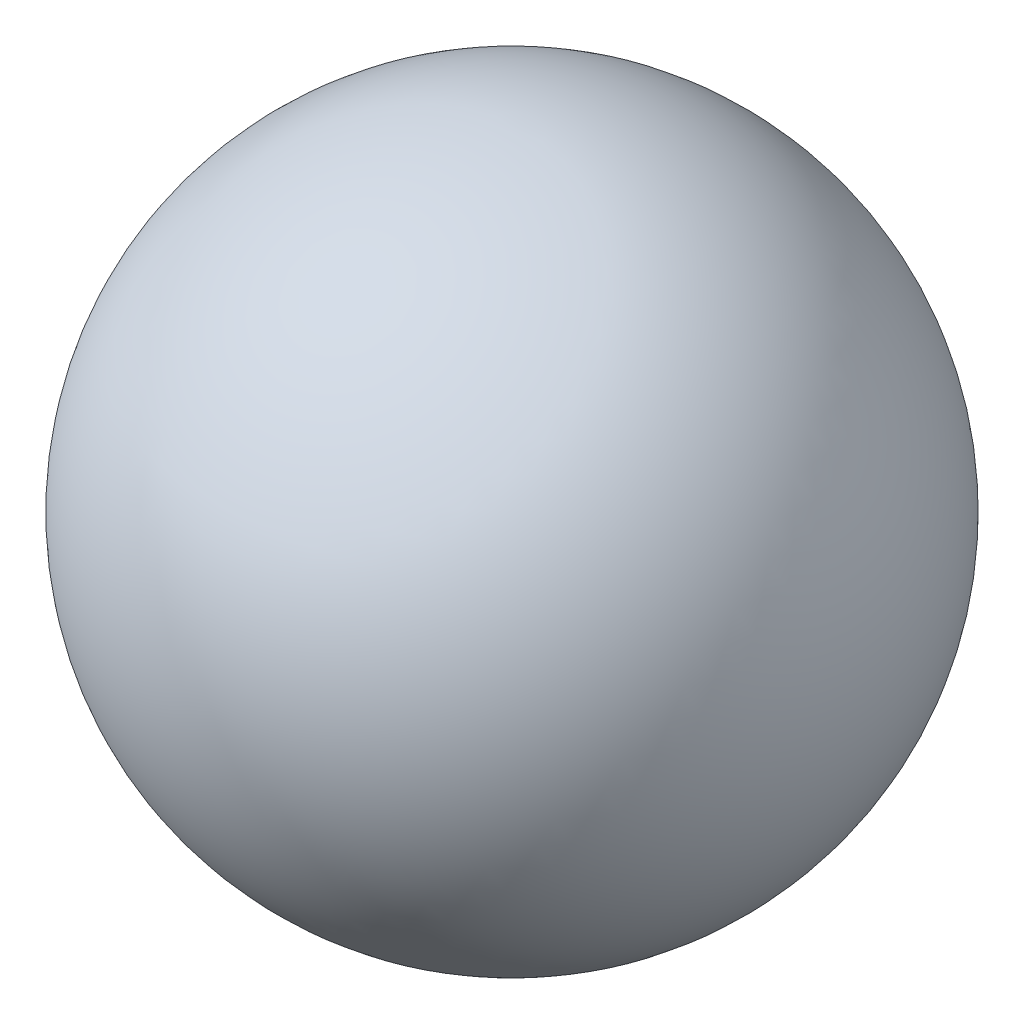
ISO-10303-21;
HEADER;
FILE_DESCRIPTION(('STEP AP214'),'2;1');
FILE_NAME('part.step','',(''),(''),'','','');
FILE_SCHEMA(('AUTOMOTIVE_DESIGN { 1 0 10303 214 1 1 1 1 }'));
ENDSEC;
DATA;
#1=APPLICATION_CONTEXT('core data for automotive mechanical design processes');
#2=APPLICATION_PROTOCOL_DEFINITION('international standard','automotive_design',2000,#1);
#3=PRODUCT_CONTEXT('',#1,'mechanical');
#4=PRODUCT('Part','Part','',(#3));
#5=PRODUCT_RELATED_PRODUCT_CATEGORY('part','',(#4));
#6=PRODUCT_DEFINITION_FORMATION('','',#4);
#7=PRODUCT_DEFINITION_CONTEXT('part definition',#1,'design');
#8=PRODUCT_DEFINITION('design','',#6,#7);
#9=PRODUCT_DEFINITION_SHAPE('','',#8);
#10=(LENGTH_UNIT() NAMED_UNIT(*) SI_UNIT(.MILLI.,.METRE.));
#11=(NAMED_UNIT(*) PLANE_ANGLE_UNIT() SI_UNIT($,.RADIAN.));
#12=(NAMED_UNIT(*) SI_UNIT($,.STERADIAN.) SOLID_ANGLE_UNIT());
#13=UNCERTAINTY_MEASURE_WITH_UNIT(LENGTH_MEASURE(1.E-05),#10,'distance_accuracy_value','');
#14=(GEOMETRIC_REPRESENTATION_CONTEXT(3) GLOBAL_UNCERTAINTY_ASSIGNED_CONTEXT((#13)) GLOBAL_UNIT_ASSIGNED_CONTEXT((#10,
#11,#12)) REPRESENTATION_CONTEXT('',''));
#15=CARTESIAN_POINT('',(0.,0.,0.));
#16=DIRECTION('',(0.,0.,1.));
#17=DIRECTION('',(1.,0.,0.));
#18=AXIS2_PLACEMENT_3D('',#15,#16,#17);
#19=CARTESIAN_POINT('',(0.,-3.96875,0.));
#20=DIRECTION('',(0.,-1.,0.));
#21=DIRECTION('',(-1.,0.,0.));
#22=AXIS2_PLACEMENT_3D('',#19,#20,#21);
#23=SPHERICAL_SURFACE('',#22,0.758760243513405);
#24=CARTESIAN_POINT('',(0.,-4.7275102435134,0.));
#25=VERTEX_POINT('',#24);
#26=VERTEX_LOOP('',#25);
#27=FACE_BOUND('',#26,.T.);
#28=ADVANCED_FACE('F34',(#27),#23,.T.);
#29=CLOSED_SHELL('',(#28));
#30=MANIFOLD_SOLID_BREP('B2',#29);
#31=ADVANCED_BREP_SHAPE_REPRESENTATION('',(#18,#30),#14);
#32=SHAPE_DEFINITION_REPRESENTATION(#9,#31);
ENDSEC;
END-ISO-10303-21;
